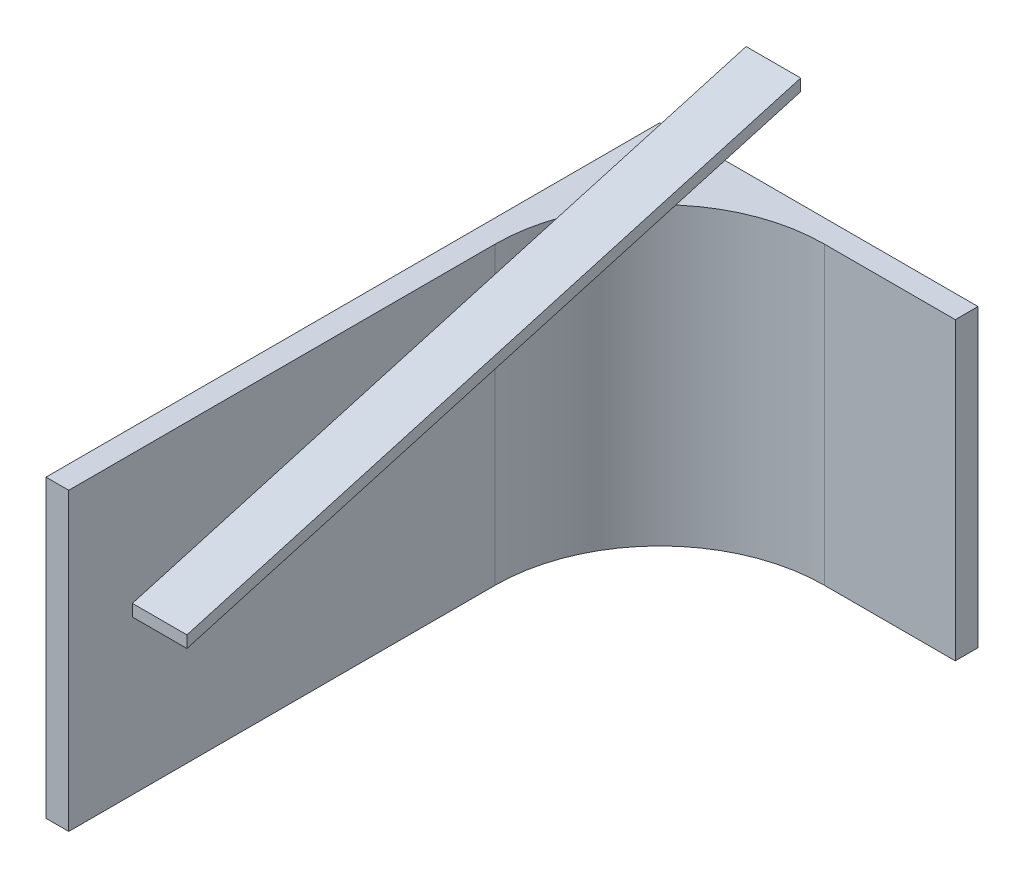
ISO-10303-21;
HEADER;
FILE_DESCRIPTION(('STEP AP214'),'2;1');
FILE_NAME('part.step','',(''),(''),'','','');
FILE_SCHEMA(('AUTOMOTIVE_DESIGN { 1 0 10303 214 1 1 1 1 }'));
ENDSEC;
DATA;
#1=APPLICATION_CONTEXT('core data for automotive mechanical design processes');
#2=APPLICATION_PROTOCOL_DEFINITION('international standard','automotive_design',2000,#1);
#3=PRODUCT_CONTEXT('',#1,'mechanical');
#4=PRODUCT('Part','Part','',(#3));
#5=PRODUCT_RELATED_PRODUCT_CATEGORY('part','',(#4));
#6=PRODUCT_DEFINITION_FORMATION('','',#4);
#7=PRODUCT_DEFINITION_CONTEXT('part definition',#1,'design');
#8=PRODUCT_DEFINITION('design','',#6,#7);
#9=PRODUCT_DEFINITION_SHAPE('','',#8);
#10=(LENGTH_UNIT() NAMED_UNIT(*) SI_UNIT(.MILLI.,.METRE.));
#11=(NAMED_UNIT(*) PLANE_ANGLE_UNIT() SI_UNIT($,.RADIAN.));
#12=(NAMED_UNIT(*) SI_UNIT($,.STERADIAN.) SOLID_ANGLE_UNIT());
#13=UNCERTAINTY_MEASURE_WITH_UNIT(LENGTH_MEASURE(1.E-05),#10,'distance_accuracy_value','');
#14=(GEOMETRIC_REPRESENTATION_CONTEXT(3) GLOBAL_UNCERTAINTY_ASSIGNED_CONTEXT((#13)) GLOBAL_UNIT_ASSIGNED_CONTEXT((#10,
#11,#12)) REPRESENTATION_CONTEXT('',''));
#15=CARTESIAN_POINT('',(0.,0.,0.));
#16=DIRECTION('',(0.,0.,1.));
#17=DIRECTION('',(1.,0.,0.));
#18=AXIS2_PLACEMENT_3D('',#15,#16,#17);
#19=CARTESIAN_POINT('',(-39.,24.028610674743,-70.));
#20=DIRECTION('',(0.,0.,-1.));
#21=DIRECTION('',(-1.,0.,0.));
#22=AXIS2_PLACEMENT_3D('',#19,#20,#21);
#23=PLANE('',#22);
#24=DIRECTION('',(0.,-1.,0.));
#25=VECTOR('',#24,1.);
#26=CARTESIAN_POINT('',(-51.,24.028610674743,-70.));
#27=LINE('',#26,#25);
#28=CARTESIAN_POINT('',(-51.,24.028610674743,-70.));
#29=VERTEX_POINT('',#28);
#30=CARTESIAN_POINT('',(-51.,21.4285714285714,-70.));
#31=VERTEX_POINT('',#30);
#32=EDGE_CURVE('E109',#29,#31,#27,.T.);
#33=ORIENTED_EDGE('',*,*,#32,.F.);
#34=DIRECTION('',(-1.,0.,0.));
#35=VECTOR('',#34,1.);
#36=CARTESIAN_POINT('',(-39.,24.028610674743,-70.));
#37=LINE('',#36,#35);
#38=CARTESIAN_POINT('',(-39.,24.028610674743,-70.));
#39=VERTEX_POINT('',#38);
#40=EDGE_CURVE('E12',#39,#29,#37,.T.);
#41=ORIENTED_EDGE('',*,*,#40,.F.);
#42=DIRECTION('',(0.,-1.,0.));
#43=VECTOR('',#42,1.);
#44=CARTESIAN_POINT('',(-39.,24.028610674743,-70.));
#45=LINE('',#44,#43);
#46=CARTESIAN_POINT('',(-39.,21.4285714285714,-70.));
#47=VERTEX_POINT('',#46);
#48=EDGE_CURVE('E103',#39,#47,#45,.T.);
#49=ORIENTED_EDGE('',*,*,#48,.T.);
#50=DIRECTION('',(-1.,0.,0.));
#51=VECTOR('',#50,1.);
#52=CARTESIAN_POINT('',(-39.,21.4285714285714,-70.));
#53=LINE('',#52,#51);
#54=EDGE_CURVE('E48',#47,#31,#53,.T.);
#55=ORIENTED_EDGE('',*,*,#54,.T.);
#56=EDGE_LOOP('',(#33,#41,#49,#55));
#57=FACE_BOUND('',#56,.T.);
#58=ADVANCED_FACE('F45',(#57),#23,.T.);
#59=CARTESIAN_POINT('',(-39.,-14.5428178966855,65.));
#60=DIRECTION('',(0.,0.961523947640823,0.274721127897378));
#61=DIRECTION('',(0.,-0.274721127897378,0.961523947640823));
#62=AXIS2_PLACEMENT_3D('',#59,#60,#61);
#63=PLANE('',#62);
#64=DIRECTION('',(0.,0.274721127897378,-0.961523947640823));
#65=VECTOR('',#64,1.);
#66=CARTESIAN_POINT('',(-51.,-14.5428178966855,65.));
#67=LINE('',#66,#65);
#68=CARTESIAN_POINT('',(-51.,-14.5428178966855,65.));
#69=VERTEX_POINT('',#68);
#70=EDGE_CURVE('E105',#69,#29,#67,.T.);
#71=ORIENTED_EDGE('',*,*,#70,.F.);
#72=DIRECTION('',(-1.,0.,0.));
#73=VECTOR('',#72,1.);
#74=CARTESIAN_POINT('',(-39.,-14.5428178966855,65.));
#75=LINE('',#74,#73);
#76=CARTESIAN_POINT('',(-39.,-14.5428178966855,65.));
#77=VERTEX_POINT('',#76);
#78=EDGE_CURVE('E54',#77,#69,#75,.T.);
#79=ORIENTED_EDGE('',*,*,#78,.F.);
#80=DIRECTION('',(0.,0.274721127897378,-0.961523947640823));
#81=VECTOR('',#80,1.);
#82=CARTESIAN_POINT('',(-39.,-14.5428178966855,65.));
#83=LINE('',#82,#81);
#84=EDGE_CURVE('E100',#77,#39,#83,.T.);
#85=ORIENTED_EDGE('',*,*,#84,.T.);
#86=ORIENTED_EDGE('',*,*,#40,.T.);
#87=EDGE_LOOP('',(#71,#79,#85,#86));
#88=FACE_BOUND('',#87,.T.);
#89=ADVANCED_FACE('F119',(#88),#63,.T.);
#90=CARTESIAN_POINT('',(-39.,-17.1428571428571,65.));
#91=DIRECTION('',(0.,0.,1.));
#92=DIRECTION('',(1.,0.,0.));
#93=AXIS2_PLACEMENT_3D('',#90,#91,#92);
#94=PLANE('',#93);
#95=DIRECTION('',(0.,1.,0.));
#96=VECTOR('',#95,1.);
#97=CARTESIAN_POINT('',(-51.,-17.1428571428571,65.));
#98=LINE('',#97,#96);
#99=CARTESIAN_POINT('',(-51.,-17.1428571428571,65.));
#100=VERTEX_POINT('',#99);
#101=EDGE_CURVE('E95',#100,#69,#98,.T.);
#102=ORIENTED_EDGE('',*,*,#101,.F.);
#103=DIRECTION('',(-1.,0.,0.));
#104=VECTOR('',#103,1.);
#105=CARTESIAN_POINT('',(-39.,-17.1428571428571,65.));
#106=LINE('',#105,#104);
#107=CARTESIAN_POINT('',(-39.,-17.1428571428571,65.));
#108=VERTEX_POINT('',#107);
#109=EDGE_CURVE('E90',#108,#100,#106,.T.);
#110=ORIENTED_EDGE('',*,*,#109,.F.);
#111=DIRECTION('',(0.,1.,0.));
#112=VECTOR('',#111,1.);
#113=CARTESIAN_POINT('',(-39.,-17.1428571428571,65.));
#114=LINE('',#113,#112);
#115=EDGE_CURVE('E93',#108,#77,#114,.T.);
#116=ORIENTED_EDGE('',*,*,#115,.T.);
#117=ORIENTED_EDGE('',*,*,#78,.T.);
#118=EDGE_LOOP('',(#102,#110,#116,#117));
#119=FACE_BOUND('',#118,.T.);
#120=ADVANCED_FACE('F92',(#119),#94,.T.);
#121=CARTESIAN_POINT('',(-39.,21.4285714285714,-70.));
#122=DIRECTION('',(0.,-0.961523947640823,-0.274721127897378));
#123=DIRECTION('',(0.,0.274721127897378,-0.961523947640823));
#124=AXIS2_PLACEMENT_3D('',#121,#122,#123);
#125=PLANE('',#124);
#126=DIRECTION('',(0.,-0.274721127897378,0.961523947640823));
#127=VECTOR('',#126,1.);
#128=CARTESIAN_POINT('',(-51.,21.4285714285714,-70.));
#129=LINE('',#128,#127);
#130=EDGE_CURVE('E112',#31,#100,#129,.T.);
#131=ORIENTED_EDGE('',*,*,#130,.F.);
#132=ORIENTED_EDGE('',*,*,#54,.F.);
#133=DIRECTION('',(0.,-0.274721127897378,0.961523947640823));
#134=VECTOR('',#133,1.);
#135=CARTESIAN_POINT('',(-39.,21.4285714285714,-70.));
#136=LINE('',#135,#134);
#137=EDGE_CURVE('E99',#47,#108,#136,.T.);
#138=ORIENTED_EDGE('',*,*,#137,.T.);
#139=ORIENTED_EDGE('',*,*,#109,.T.);
#140=EDGE_LOOP('',(#131,#132,#138,#139));
#141=FACE_BOUND('',#140,.T.);
#142=ADVANCED_FACE('F102',(#141),#125,.T.);
#143=CARTESIAN_POINT('',(-39.,0.,0.));
#144=DIRECTION('',(-1.,0.,0.));
#145=DIRECTION('',(0.,0.,1.));
#146=AXIS2_PLACEMENT_3D('',#143,#144,#145);
#147=PLANE('',#146);
#148=ORIENTED_EDGE('',*,*,#48,.F.);
#149=ORIENTED_EDGE('',*,*,#84,.F.);
#150=ORIENTED_EDGE('',*,*,#115,.F.);
#151=ORIENTED_EDGE('',*,*,#137,.F.);
#152=EDGE_LOOP('',(#148,#149,#150,#151));
#153=FACE_BOUND('',#152,.T.);
#154=ADVANCED_FACE('F98',(#153),#147,.F.);
#155=CARTESIAN_POINT('',(-51.,0.,0.));
#156=DIRECTION('',(-1.,0.,0.));
#157=DIRECTION('',(0.,0.,1.));
#158=AXIS2_PLACEMENT_3D('',#155,#156,#157);
#159=PLANE('',#158);
#160=ORIENTED_EDGE('',*,*,#32,.T.);
#161=ORIENTED_EDGE('',*,*,#130,.T.);
#162=ORIENTED_EDGE('',*,*,#101,.T.);
#163=ORIENTED_EDGE('',*,*,#70,.T.);
#164=EDGE_LOOP('',(#160,#161,#162,#163));
#165=FACE_BOUND('',#164,.T.);
#166=ADVANCED_FACE('F118',(#165),#159,.T.);
#167=CLOSED_SHELL('',(#58,#89,#120,#142,#154,#166));
#168=MANIFOLD_SOLID_BREP('B2',#167);
#169=CARTESIAN_POINT('',(-65.,-65.,0.));
#170=DIRECTION('',(-1.,0.,0.));
#171=DIRECTION('',(0.,0.,1.));
#172=AXIS2_PLACEMENT_3D('',#169,#170,#171);
#173=PLANE('',#172);
#174=DIRECTION('',(0.,0.,1.));
#175=VECTOR('',#174,1.);
#176=CARTESIAN_POINT('',(-65.,0.,0.));
#177=LINE('',#176,#175);
#178=CARTESIAN_POINT('',(-65.,0.,-28.7867965644036));
#179=VERTEX_POINT('',#178);
#180=CARTESIAN_POINT('',(-65.,0.,65.));
#181=VERTEX_POINT('',#180);
#182=EDGE_CURVE('E257',#179,#181,#177,.T.);
#183=ORIENTED_EDGE('',*,*,#182,.T.);
#184=DIRECTION('',(0.,1.,0.));
#185=VECTOR('',#184,1.);
#186=CARTESIAN_POINT('',(-65.,-65.,65.));
#187=LINE('',#186,#185);
#188=CARTESIAN_POINT('',(-65.,-65.,65.));
#189=VERTEX_POINT('',#188);
#190=EDGE_CURVE('E43',#189,#181,#187,.T.);
#191=ORIENTED_EDGE('',*,*,#190,.F.);
#192=DIRECTION('',(0.,0.,1.));
#193=VECTOR('',#192,1.);
#194=CARTESIAN_POINT('',(-65.,-65.,0.));
#195=LINE('',#194,#193);
#196=CARTESIAN_POINT('',(-65.,-65.,-28.7867965644036));
#197=VERTEX_POINT('',#196);
#198=EDGE_CURVE('E269',#197,#189,#195,.T.);
#199=ORIENTED_EDGE('',*,*,#198,.F.);
#200=DIRECTION('',(0.,1.,0.));
#201=VECTOR('',#200,1.);
#202=CARTESIAN_POINT('',(-65.,-65.,-28.7867965644036));
#203=LINE('',#202,#201);
#204=EDGE_CURVE('E171',#197,#179,#203,.T.);
#205=ORIENTED_EDGE('',*,*,#204,.T.);
#206=EDGE_LOOP('',(#183,#191,#199,#205));
#207=FACE_BOUND('',#206,.T.);
#208=ADVANCED_FACE('F168',(#207),#173,.F.);
#209=CARTESIAN_POINT('',(1.80411241501587E-13,-65.,64.9999999999998));
#210=DIRECTION('',(0.,0.,-1.));
#211=DIRECTION('',(-1.,0.,0.));
#212=AXIS2_PLACEMENT_3D('',#209,#210,#211);
#213=PLANE('',#212);
#214=DIRECTION('',(-1.,0.,0.));
#215=VECTOR('',#214,1.);
#216=CARTESIAN_POINT('',(1.80411241501587E-13,0.,64.9999999999998));
#217=LINE('',#216,#215);
#218=CARTESIAN_POINT('',(-70.,0.,65.));
#219=VERTEX_POINT('',#218);
#220=EDGE_CURVE('E208',#181,#219,#217,.T.);
#221=ORIENTED_EDGE('',*,*,#220,.T.);
#222=DIRECTION('',(0.,1.,0.));
#223=VECTOR('',#222,1.);
#224=CARTESIAN_POINT('',(-70.,-65.,65.));
#225=LINE('',#224,#223);
#226=CARTESIAN_POINT('',(-70.,-65.,65.));
#227=VERTEX_POINT('',#226);
#228=EDGE_CURVE('E177',#227,#219,#225,.T.);
#229=ORIENTED_EDGE('',*,*,#228,.F.);
#230=DIRECTION('',(-1.,0.,0.));
#231=VECTOR('',#230,1.);
#232=CARTESIAN_POINT('',(1.80411241501587E-13,-65.,64.9999999999998));
#233=LINE('',#232,#231);
#234=EDGE_CURVE('E185',#189,#227,#233,.T.);
#235=ORIENTED_EDGE('',*,*,#234,.F.);
#236=ORIENTED_EDGE('',*,*,#190,.T.);
#237=EDGE_LOOP('',(#221,#229,#235,#236));
#238=FACE_BOUND('',#237,.T.);
#239=ADVANCED_FACE('F299',(#238),#213,.F.);
#240=CARTESIAN_POINT('',(-70.,-65.,0.));
#241=DIRECTION('',(1.,0.,0.));
#242=DIRECTION('',(0.,0.,-1.));
#243=AXIS2_PLACEMENT_3D('',#240,#241,#242);
#244=PLANE('',#243);
#245=DIRECTION('',(0.,0.,-1.));
#246=VECTOR('',#245,1.);
#247=CARTESIAN_POINT('',(-70.,0.,0.));
#248=LINE('',#247,#246);
#249=CARTESIAN_POINT('',(-70.,0.,-70.));
#250=VERTEX_POINT('',#249);
#251=EDGE_CURVE('E242',#219,#250,#248,.T.);
#252=ORIENTED_EDGE('',*,*,#251,.T.);
#253=DIRECTION('',(0.,1.,0.));
#254=VECTOR('',#253,1.);
#255=CARTESIAN_POINT('',(-70.,-65.,-70.));
#256=LINE('',#255,#254);
#257=CARTESIAN_POINT('',(-70.,-65.,-70.));
#258=VERTEX_POINT('',#257);
#259=EDGE_CURVE('E240',#258,#250,#256,.T.);
#260=ORIENTED_EDGE('',*,*,#259,.F.);
#261=DIRECTION('',(0.,0.,-1.));
#262=VECTOR('',#261,1.);
#263=CARTESIAN_POINT('',(-70.,-65.,0.));
#264=LINE('',#263,#262);
#265=EDGE_CURVE('E231',#227,#258,#264,.T.);
#266=ORIENTED_EDGE('',*,*,#265,.F.);
#267=ORIENTED_EDGE('',*,*,#228,.T.);
#268=EDGE_LOOP('',(#252,#260,#266,#267));
#269=FACE_BOUND('',#268,.T.);
#270=ADVANCED_FACE('F241',(#269),#244,.F.);
#271=CARTESIAN_POINT('',(0.,-65.,-70.));
#272=DIRECTION('',(0.,0.,1.));
#273=DIRECTION('',(1.,0.,0.));
#274=AXIS2_PLACEMENT_3D('',#271,#272,#273);
#275=PLANE('',#274);
#276=DIRECTION('',(1.,0.,0.));
#277=VECTOR('',#276,1.);
#278=CARTESIAN_POINT('',(0.,0.,-70.));
#279=LINE('',#278,#277);
#280=CARTESIAN_POINT('',(0.,0.,-70.));
#281=VERTEX_POINT('',#280);
#282=EDGE_CURVE('E266',#250,#281,#279,.T.);
#283=ORIENTED_EDGE('',*,*,#282,.T.);
#284=DIRECTION('',(0.,1.,0.));
#285=VECTOR('',#284,1.);
#286=CARTESIAN_POINT('',(0.,-65.,-70.));
#287=LINE('',#286,#285);
#288=CARTESIAN_POINT('',(0.,-65.,-70.));
#289=VERTEX_POINT('',#288);
#290=EDGE_CURVE('E245',#289,#281,#287,.T.);
#291=ORIENTED_EDGE('',*,*,#290,.F.);
#292=DIRECTION('',(1.,0.,0.));
#293=VECTOR('',#292,1.);
#294=CARTESIAN_POINT('',(0.,-65.,-70.));
#295=LINE('',#294,#293);
#296=EDGE_CURVE('E235',#258,#289,#295,.T.);
#297=ORIENTED_EDGE('',*,*,#296,.F.);
#298=ORIENTED_EDGE('',*,*,#259,.T.);
#299=EDGE_LOOP('',(#283,#291,#297,#298));
#300=FACE_BOUND('',#299,.T.);
#301=ADVANCED_FACE('F247',(#300),#275,.F.);
#302=CARTESIAN_POINT('',(0.,-65.,0.));
#303=DIRECTION('',(-1.,0.,0.));
#304=DIRECTION('',(0.,0.,1.));
#305=AXIS2_PLACEMENT_3D('',#302,#303,#304);
#306=PLANE('',#305);
#307=DIRECTION('',(0.,0.,1.));
#308=VECTOR('',#307,1.);
#309=CARTESIAN_POINT('',(0.,0.,0.));
#310=LINE('',#309,#308);
#311=CARTESIAN_POINT('',(0.,0.,-65.));
#312=VERTEX_POINT('',#311);
#313=EDGE_CURVE('E264',#281,#312,#310,.T.);
#314=ORIENTED_EDGE('',*,*,#313,.T.);
#315=DIRECTION('',(0.,1.,0.));
#316=VECTOR('',#315,1.);
#317=CARTESIAN_POINT('',(0.,-65.,-65.));
#318=LINE('',#317,#316);
#319=CARTESIAN_POINT('',(0.,-65.,-65.));
#320=VERTEX_POINT('',#319);
#321=EDGE_CURVE('E273',#320,#312,#318,.T.);
#322=ORIENTED_EDGE('',*,*,#321,.F.);
#323=DIRECTION('',(0.,0.,1.));
#324=VECTOR('',#323,1.);
#325=CARTESIAN_POINT('',(0.,-65.,0.));
#326=LINE('',#325,#324);
#327=EDGE_CURVE('E250',#289,#320,#326,.T.);
#328=ORIENTED_EDGE('',*,*,#327,.F.);
#329=ORIENTED_EDGE('',*,*,#290,.T.);
#330=EDGE_LOOP('',(#314,#322,#328,#329));
#331=FACE_BOUND('',#330,.T.);
#332=ADVANCED_FACE('F295',(#331),#306,.F.);
#333=CARTESIAN_POINT('',(0.,-65.,-65.));
#334=DIRECTION('',(0.,0.,-1.));
#335=DIRECTION('',(-1.,0.,0.));
#336=AXIS2_PLACEMENT_3D('',#333,#334,#335);
#337=PLANE('',#336);
#338=DIRECTION('',(-1.,0.,0.));
#339=VECTOR('',#338,1.);
#340=CARTESIAN_POINT('',(0.,0.,-65.));
#341=LINE('',#340,#339);
#342=CARTESIAN_POINT('',(-28.7867965644036,0.,-65.));
#343=VERTEX_POINT('',#342);
#344=EDGE_CURVE('E262',#312,#343,#341,.T.);
#345=ORIENTED_EDGE('',*,*,#344,.T.);
#346=DIRECTION('',(0.,1.,0.));
#347=VECTOR('',#346,1.);
#348=CARTESIAN_POINT('',(-28.7867965644036,-65.,-65.));
#349=LINE('',#348,#347);
#350=CARTESIAN_POINT('',(-28.7867965644036,-65.,-65.));
#351=VERTEX_POINT('',#350);
#352=EDGE_CURVE('E275',#351,#343,#349,.T.);
#353=ORIENTED_EDGE('',*,*,#352,.F.);
#354=DIRECTION('',(-1.,0.,0.));
#355=VECTOR('',#354,1.);
#356=CARTESIAN_POINT('',(0.,-65.,-65.));
#357=LINE('',#356,#355);
#358=EDGE_CURVE('E252',#320,#351,#357,.T.);
#359=ORIENTED_EDGE('',*,*,#358,.F.);
#360=ORIENTED_EDGE('',*,*,#321,.T.);
#361=EDGE_LOOP('',(#345,#353,#359,#360));
#362=FACE_BOUND('',#361,.T.);
#363=ADVANCED_FACE('F289',(#362),#337,.F.);
#364=CARTESIAN_POINT('',(-28.7867965644036,-65.,-28.7867965644036));
#365=DIRECTION('',(0.,1.,0.));
#366=DIRECTION('',(0.,0.,1.));
#367=AXIS2_PLACEMENT_3D('',#364,#365,#366);
#368=CYLINDRICAL_SURFACE('',#367,36.2132034355964);
#369=CARTESIAN_POINT('',(-28.7867965644036,0.,-28.7867965644036));
#370=DIRECTION('',(0.,1.,0.));
#371=DIRECTION('',(0.,0.,1.));
#372=AXIS2_PLACEMENT_3D('',#369,#370,#371);
#373=CIRCLE('',#372,36.2132034355964);
#374=EDGE_CURVE('E260',#343,#179,#373,.T.);
#375=ORIENTED_EDGE('',*,*,#374,.T.);
#376=ORIENTED_EDGE('',*,*,#204,.F.);
#377=CARTESIAN_POINT('',(-28.7867965644036,-65.,-28.7867965644036));
#378=DIRECTION('',(0.,1.,0.));
#379=DIRECTION('',(0.,0.,1.));
#380=AXIS2_PLACEMENT_3D('',#377,#378,#379);
#381=CIRCLE('',#380,36.2132034355964);
#382=EDGE_CURVE('E220',#351,#197,#381,.T.);
#383=ORIENTED_EDGE('',*,*,#382,.F.);
#384=ORIENTED_EDGE('',*,*,#352,.T.);
#385=EDGE_LOOP('',(#375,#376,#383,#384));
#386=FACE_BOUND('',#385,.T.);
#387=ADVANCED_FACE('F287',(#386),#368,.F.);
#388=CARTESIAN_POINT('',(0.,-65.,0.));
#389=DIRECTION('',(0.,1.,0.));
#390=DIRECTION('',(0.,0.,1.));
#391=AXIS2_PLACEMENT_3D('',#388,#389,#390);
#392=PLANE('',#391);
#393=ORIENTED_EDGE('',*,*,#198,.T.);
#394=ORIENTED_EDGE('',*,*,#234,.T.);
#395=ORIENTED_EDGE('',*,*,#265,.T.);
#396=ORIENTED_EDGE('',*,*,#296,.T.);
#397=ORIENTED_EDGE('',*,*,#327,.T.);
#398=ORIENTED_EDGE('',*,*,#358,.T.);
#399=ORIENTED_EDGE('',*,*,#382,.T.);
#400=EDGE_LOOP('',(#393,#394,#395,#396,#397,#398,#399));
#401=FACE_BOUND('',#400,.T.);
#402=ADVANCED_FACE('F233',(#401),#392,.F.);
#403=CARTESIAN_POINT('',(0.,0.,0.));
#404=DIRECTION('',(0.,1.,0.));
#405=DIRECTION('',(0.,0.,1.));
#406=AXIS2_PLACEMENT_3D('',#403,#404,#405);
#407=PLANE('',#406);
#408=ORIENTED_EDGE('',*,*,#182,.F.);
#409=ORIENTED_EDGE('',*,*,#374,.F.);
#410=ORIENTED_EDGE('',*,*,#344,.F.);
#411=ORIENTED_EDGE('',*,*,#313,.F.);
#412=ORIENTED_EDGE('',*,*,#282,.F.);
#413=ORIENTED_EDGE('',*,*,#251,.F.);
#414=ORIENTED_EDGE('',*,*,#220,.F.);
#415=EDGE_LOOP('',(#408,#409,#410,#411,#412,#413,#414));
#416=FACE_BOUND('',#415,.T.);
#417=ADVANCED_FACE('F284',(#416),#407,.T.);
#418=CLOSED_SHELL('',(#208,#239,#270,#301,#332,#363,#387,#402,#417));
#419=MANIFOLD_SOLID_BREP('B6',#418);
#420=ADVANCED_BREP_SHAPE_REPRESENTATION('',(#18,#168,#419),#14);
#421=SHAPE_DEFINITION_REPRESENTATION(#9,#420);
ENDSEC;
END-ISO-10303-21;
